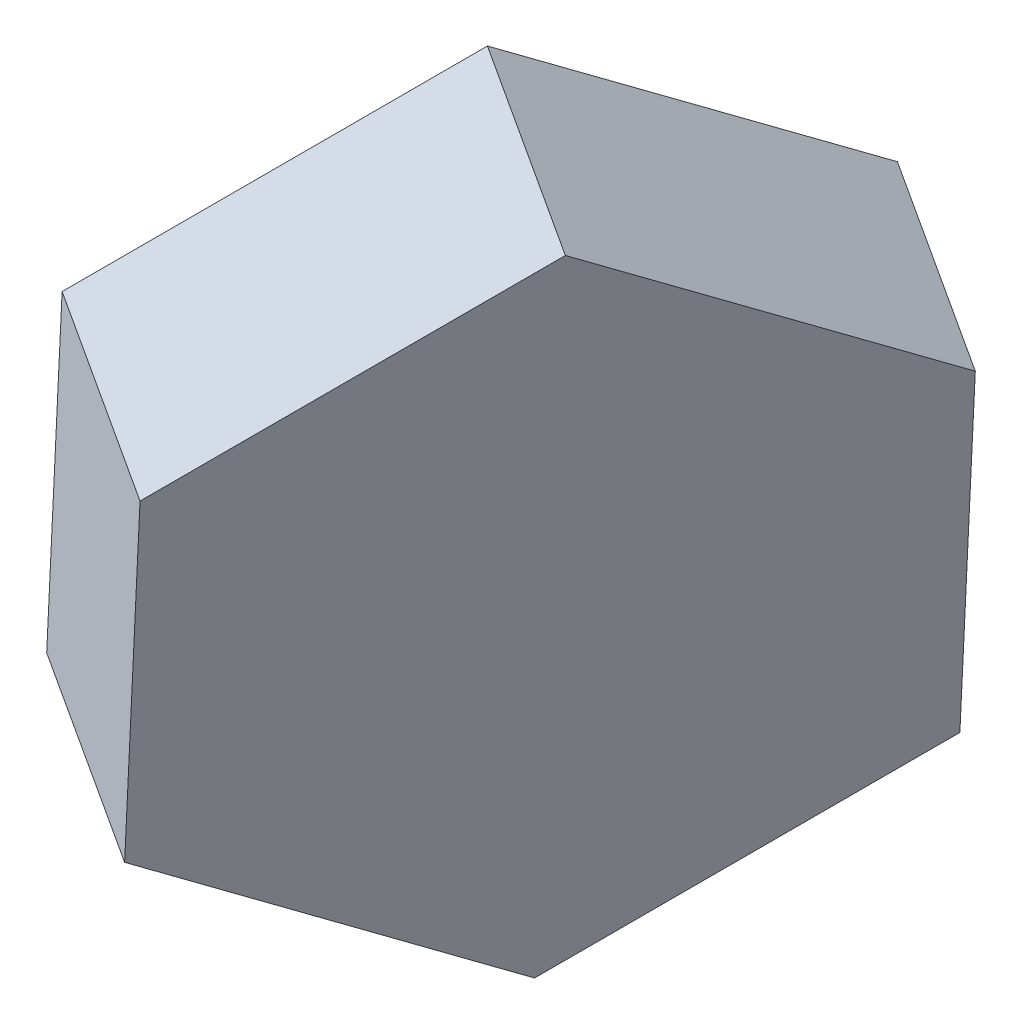
ISO-10303-21;
HEADER;
FILE_DESCRIPTION(('STEP AP214'),'2;1');
FILE_NAME('part.step','',(''),(''),'','','');
FILE_SCHEMA(('AUTOMOTIVE_DESIGN { 1 0 10303 214 1 1 1 1 }'));
ENDSEC;
DATA;
#1=APPLICATION_CONTEXT('core data for automotive mechanical design processes');
#2=APPLICATION_PROTOCOL_DEFINITION('international standard','automotive_design',2000,#1);
#3=PRODUCT_CONTEXT('',#1,'mechanical');
#4=PRODUCT('Part','Part','',(#3));
#5=PRODUCT_RELATED_PRODUCT_CATEGORY('part','',(#4));
#6=PRODUCT_DEFINITION_FORMATION('','',#4);
#7=PRODUCT_DEFINITION_CONTEXT('part definition',#1,'design');
#8=PRODUCT_DEFINITION('design','',#6,#7);
#9=PRODUCT_DEFINITION_SHAPE('','',#8);
#10=(LENGTH_UNIT() NAMED_UNIT(*) SI_UNIT(.MILLI.,.METRE.));
#11=(NAMED_UNIT(*) PLANE_ANGLE_UNIT() SI_UNIT($,.RADIAN.));
#12=(NAMED_UNIT(*) SI_UNIT($,.STERADIAN.) SOLID_ANGLE_UNIT());
#13=UNCERTAINTY_MEASURE_WITH_UNIT(LENGTH_MEASURE(1.E-05),#10,'distance_accuracy_value','');
#14=(GEOMETRIC_REPRESENTATION_CONTEXT(3) GLOBAL_UNCERTAINTY_ASSIGNED_CONTEXT((#13)) GLOBAL_UNIT_ASSIGNED_CONTEXT((#10,
#11,#12)) REPRESENTATION_CONTEXT('',''));
#15=CARTESIAN_POINT('',(0.,0.,0.));
#16=DIRECTION('',(0.,0.,1.));
#17=DIRECTION('',(1.,0.,0.));
#18=AXIS2_PLACEMENT_3D('',#15,#16,#17);
#19=CARTESIAN_POINT('',(12.2624510546371,7.26245105463715,-3.80619068347139));
#20=DIRECTION('',(-0.359789397188855,-0.859789397188857,0.362372435695795));
#21=DIRECTION('',(0.376826484044321,-0.489198919740116,-0.786566092485494));
#22=AXIS2_PLACEMENT_3D('',#19,#20,#21);
#23=PLANE('',#22);
#24=DIRECTION('',(-0.376826484044321,0.489198919740116,0.786566092485494));
#25=VECTOR('',#24,1.);
#26=CARTESIAN_POINT('',(3.72691714870437,8.72691714870441,-8.80619068347137));
#27=LINE('',#26,#25);
#28=CARTESIAN_POINT('',(3.72691714870437,8.72691714870441,-8.80619068347137));
#29=VERTEX_POINT('',#28);
#30=CARTESIAN_POINT('',(-2.29830025345089,16.5488988011061,3.77050418554278));
#31=VERTEX_POINT('',#30);
#32=EDGE_CURVE('E119',#29,#31,#27,.T.);
#33=ORIENTED_EDGE('',*,*,#32,.T.);
#34=DIRECTION('',(-0.853553390593275,0.146446609406726,-0.499999999999998));
#35=VECTOR('',#34,1.);
#36=CARTESIAN_POINT('',(6.23723365248186,15.0844327070388,8.77050418554277));
#37=LINE('',#36,#35);
#38=CARTESIAN_POINT('',(6.23723365248186,15.0844327070388,8.77050418554277));
#39=VERTEX_POINT('',#38);
#40=EDGE_CURVE('E42',#39,#31,#37,.T.);
#41=ORIENTED_EDGE('',*,*,#40,.F.);
#42=DIRECTION('',(-0.376826484044321,0.489198919740116,0.786566092485494));
#43=VECTOR('',#42,1.);
#44=CARTESIAN_POINT('',(12.2624510546371,7.26245105463715,-3.80619068347139));
#45=LINE('',#44,#43);
#46=CARTESIAN_POINT('',(12.2624510546371,7.26245105463715,-3.80619068347139));
#47=VERTEX_POINT('',#46);
#48=EDGE_CURVE('E130',#47,#39,#45,.T.);
#49=ORIENTED_EDGE('',*,*,#48,.F.);
#50=DIRECTION('',(-0.853553390593275,0.146446609406726,-0.499999999999998));
#51=VECTOR('',#50,1.);
#52=CARTESIAN_POINT('',(12.2624510546371,7.26245105463715,-3.80619068347139));
#53=LINE('',#52,#51);
#54=EDGE_CURVE('E115',#47,#29,#53,.T.);
#55=ORIENTED_EDGE('',*,*,#54,.T.);
#56=EDGE_LOOP('',(#33,#41,#49,#55));
#57=FACE_BOUND('',#56,.T.);
#58=ADVANCED_FACE('F34',(#57),#23,.F.);
#59=CARTESIAN_POINT('',(6.23723365248186,15.0844327070388,8.77050418554277));
#60=DIRECTION('',(0.146446609406726,-0.853553390593274,-0.5));
#61=DIRECTION('',(0.499999999999998,0.5,-0.707106781186549));
#62=AXIS2_PLACEMENT_3D('',#59,#60,#61);
#63=PLANE('',#62);
#64=DIRECTION('',(-0.499999999999998,-0.5,0.707106781186549));
#65=VECTOR('',#64,1.);
#66=CARTESIAN_POINT('',(-2.29830025345089,16.5488988011061,3.77050418554278));
#67=LINE('',#66,#65);
#68=CARTESIAN_POINT('',(-10.2929843551216,8.55421469943528,15.0766948690142));
#69=VERTEX_POINT('',#68);
#70=EDGE_CURVE('E122',#31,#69,#67,.T.);
#71=ORIENTED_EDGE('',*,*,#70,.T.);
#72=DIRECTION('',(-0.853553390593275,0.146446609406726,-0.499999999999998));
#73=VECTOR('',#72,1.);
#74=CARTESIAN_POINT('',(-1.75745044918888,7.08974860536802,20.0766948690141));
#75=LINE('',#74,#73);
#76=CARTESIAN_POINT('',(-1.75745044918888,7.08974860536802,20.0766948690141));
#77=VERTEX_POINT('',#76);
#78=EDGE_CURVE('E134',#77,#69,#75,.T.);
#79=ORIENTED_EDGE('',*,*,#78,.F.);
#80=DIRECTION('',(-0.499999999999998,-0.5,0.707106781186549));
#81=VECTOR('',#80,1.);
#82=CARTESIAN_POINT('',(6.23723365248186,15.0844327070388,8.77050418554277));
#83=LINE('',#82,#81);
#84=EDGE_CURVE('E88',#39,#77,#83,.T.);
#85=ORIENTED_EDGE('',*,*,#84,.F.);
#86=ORIENTED_EDGE('',*,*,#40,.T.);
#87=EDGE_LOOP('',(#71,#79,#85,#86));
#88=FACE_BOUND('',#87,.T.);
#89=ADVANCED_FACE('F137',(#88),#63,.F.);
#90=CARTESIAN_POINT('',(-1.75745044918888,7.08974860536802,20.0766948690141));
#91=DIRECTION('',(0.506236006595581,0.00623600659558271,-0.862372435695796));
#92=DIRECTION('',(0.123173515955677,0.989198919740117,0.0794593112989452));
#93=AXIS2_PLACEMENT_3D('',#90,#91,#92);
#94=PLANE('',#93);
#95=DIRECTION('',(-0.123173515955677,-0.989198919740117,-0.0794593112989452));
#96=VECTOR('',#95,1.);
#97=CARTESIAN_POINT('',(-10.2929843551216,8.55421469943528,15.0766948690142));
#98=LINE('',#97,#96);
#99=CARTESIAN_POINT('',(-12.2624510546371,-7.26245105463714,13.8061906834714));
#100=VERTEX_POINT('',#99);
#101=EDGE_CURVE('E125',#69,#100,#98,.T.);
#102=ORIENTED_EDGE('',*,*,#101,.T.);
#103=DIRECTION('',(-0.853553390593275,0.146446609406726,-0.499999999999998));
#104=VECTOR('',#103,1.);
#105=CARTESIAN_POINT('',(-3.72691714870437,-8.7269171487044,18.8061906834714));
#106=LINE('',#105,#104);
#107=CARTESIAN_POINT('',(-3.72691714870437,-8.7269171487044,18.8061906834714));
#108=VERTEX_POINT('',#107);
#109=EDGE_CURVE('E110',#108,#100,#106,.T.);
#110=ORIENTED_EDGE('',*,*,#109,.F.);
#111=DIRECTION('',(-0.123173515955677,-0.989198919740117,-0.0794593112989452));
#112=VECTOR('',#111,1.);
#113=CARTESIAN_POINT('',(-1.75745044918888,7.08974860536802,20.0766948690141));
#114=LINE('',#113,#112);
#115=EDGE_CURVE('E101',#77,#108,#114,.T.);
#116=ORIENTED_EDGE('',*,*,#115,.F.);
#117=ORIENTED_EDGE('',*,*,#78,.T.);
#118=EDGE_LOOP('',(#102,#110,#116,#117));
#119=FACE_BOUND('',#118,.T.);
#120=ADVANCED_FACE('F145',(#119),#94,.F.);
#121=CARTESIAN_POINT('',(-3.72691714870437,-8.7269171487044,18.8061906834714));
#122=DIRECTION('',(0.359789397188855,0.859789397188856,-0.362372435695796));
#123=DIRECTION('',(-0.376826484044321,0.489198919740117,0.786566092485494));
#124=AXIS2_PLACEMENT_3D('',#121,#122,#123);
#125=PLANE('',#124);
#126=DIRECTION('',(0.376826484044321,-0.489198919740117,-0.786566092485494));
#127=VECTOR('',#126,1.);
#128=CARTESIAN_POINT('',(-12.2624510546371,-7.26245105463714,13.8061906834714));
#129=LINE('',#128,#127);
#130=CARTESIAN_POINT('',(-6.23723365248187,-15.0844327070388,1.22949581445724));
#131=VERTEX_POINT('',#130);
#132=EDGE_CURVE('E109',#100,#131,#129,.T.);
#133=ORIENTED_EDGE('',*,*,#132,.T.);
#134=DIRECTION('',(-0.853553390593275,0.146446609406726,-0.499999999999998));
#135=VECTOR('',#134,1.);
#136=CARTESIAN_POINT('',(2.29830025345088,-16.548898801106,6.22949581445722));
#137=LINE('',#136,#135);
#138=CARTESIAN_POINT('',(2.29830025345088,-16.548898801106,6.22949581445722));
#139=VERTEX_POINT('',#138);
#140=EDGE_CURVE('E106',#139,#131,#137,.T.);
#141=ORIENTED_EDGE('',*,*,#140,.F.);
#142=DIRECTION('',(0.376826484044321,-0.489198919740117,-0.786566092485494));
#143=VECTOR('',#142,1.);
#144=CARTESIAN_POINT('',(-3.72691714870437,-8.7269171487044,18.8061906834714));
#145=LINE('',#144,#143);
#146=EDGE_CURVE('E95',#108,#139,#145,.T.);
#147=ORIENTED_EDGE('',*,*,#146,.F.);
#148=ORIENTED_EDGE('',*,*,#109,.T.);
#149=EDGE_LOOP('',(#133,#141,#147,#148));
#150=FACE_BOUND('',#149,.T.);
#151=ADVANCED_FACE('F107',(#150),#125,.F.);
#152=CARTESIAN_POINT('',(2.29830025345088,-16.548898801106,6.22949581445722));
#153=DIRECTION('',(-0.146446609406726,0.853553390593274,0.5));
#154=DIRECTION('',(0.853553390593275,-0.146446609406726,0.499999999999998));
#155=AXIS2_PLACEMENT_3D('',#152,#153,#154);
#156=PLANE('',#155);
#157=DIRECTION('',(0.499999999999998,0.5,-0.707106781186549));
#158=VECTOR('',#157,1.);
#159=CARTESIAN_POINT('',(-6.23723365248187,-15.0844327070388,1.22949581445724));
#160=LINE('',#159,#158);
#161=CARTESIAN_POINT('',(1.75745044918888,-7.08974860536802,-10.0766948690141));
#162=VERTEX_POINT('',#161);
#163=EDGE_CURVE('E73',#131,#162,#160,.T.);
#164=ORIENTED_EDGE('',*,*,#163,.T.);
#165=DIRECTION('',(-0.853553390593275,0.146446609406726,-0.499999999999998));
#166=VECTOR('',#165,1.);
#167=CARTESIAN_POINT('',(10.2929843551216,-8.55421469943528,-5.07669486901416));
#168=LINE('',#167,#166);
#169=CARTESIAN_POINT('',(10.2929843551216,-8.55421469943528,-5.07669486901416));
#170=VERTEX_POINT('',#169);
#171=EDGE_CURVE('E111',#170,#162,#168,.T.);
#172=ORIENTED_EDGE('',*,*,#171,.F.);
#173=DIRECTION('',(0.499999999999998,0.5,-0.707106781186549));
#174=VECTOR('',#173,1.);
#175=CARTESIAN_POINT('',(2.29830025345088,-16.548898801106,6.22949581445722));
#176=LINE('',#175,#174);
#177=EDGE_CURVE('E99',#139,#170,#176,.T.);
#178=ORIENTED_EDGE('',*,*,#177,.F.);
#179=ORIENTED_EDGE('',*,*,#140,.T.);
#180=EDGE_LOOP('',(#164,#172,#178,#179));
#181=FACE_BOUND('',#180,.T.);
#182=ADVANCED_FACE('F113',(#181),#156,.F.);
#183=CARTESIAN_POINT('',(10.2929843551216,-8.55421469943528,-5.07669486901416));
#184=DIRECTION('',(-0.506236006595581,-0.00623600659558249,0.862372435695796));
#185=DIRECTION('',(-0.123173515955678,-0.989198919740117,-0.0794593112989451));
#186=AXIS2_PLACEMENT_3D('',#183,#184,#185);
#187=PLANE('',#186);
#188=DIRECTION('',(0.123173515955678,0.989198919740117,0.0794593112989451));
#189=VECTOR('',#188,1.);
#190=CARTESIAN_POINT('',(1.75745044918888,-7.08974860536802,-10.0766948690141));
#191=LINE('',#190,#189);
#192=EDGE_CURVE('E79',#162,#29,#191,.T.);
#193=ORIENTED_EDGE('',*,*,#192,.T.);
#194=ORIENTED_EDGE('',*,*,#54,.F.);
#195=DIRECTION('',(0.123173515955678,0.989198919740117,0.0794593112989451));
#196=VECTOR('',#195,1.);
#197=CARTESIAN_POINT('',(10.2929843551216,-8.55421469943528,-5.07669486901416));
#198=LINE('',#197,#196);
#199=EDGE_CURVE('E50',#170,#47,#198,.T.);
#200=ORIENTED_EDGE('',*,*,#199,.F.);
#201=ORIENTED_EDGE('',*,*,#171,.T.);
#202=EDGE_LOOP('',(#193,#194,#200,#201));
#203=FACE_BOUND('',#202,.T.);
#204=ADVANCED_FACE('F167',(#203),#187,.F.);
#205=CARTESIAN_POINT('',(4.26776695296637,-0.732233047033628,7.49999999999999));
#206=DIRECTION('',(0.853553390593275,-0.146446609406726,0.499999999999998));
#207=DIRECTION('',(0.499999999999998,0.5,-0.707106781186549));
#208=AXIS2_PLACEMENT_3D('',#205,#206,#207);
#209=PLANE('',#208);
#210=ORIENTED_EDGE('',*,*,#48,.T.);
#211=ORIENTED_EDGE('',*,*,#84,.T.);
#212=ORIENTED_EDGE('',*,*,#115,.T.);
#213=ORIENTED_EDGE('',*,*,#146,.T.);
#214=ORIENTED_EDGE('',*,*,#177,.T.);
#215=ORIENTED_EDGE('',*,*,#199,.T.);
#216=EDGE_LOOP('',(#210,#211,#212,#213,#214,#215));
#217=FACE_BOUND('',#216,.T.);
#218=ADVANCED_FACE('F97',(#217),#209,.T.);
#219=CARTESIAN_POINT('',(-4.26776695296638,0.732233047033629,2.50000000000001));
#220=DIRECTION('',(0.853553390593275,-0.146446609406726,0.499999999999998));
#221=DIRECTION('',(0.499999999999998,0.5,-0.707106781186549));
#222=AXIS2_PLACEMENT_3D('',#219,#220,#221);
#223=PLANE('',#222);
#224=CARTESIAN_POINT('',(-4.26776695296638,0.73223304703363,2.50000000000001));
#225=DIRECTION('',(0.853553390593275,-0.146446609406726,0.499999999999998));
#226=DIRECTION('',(0.505449465124422,0.,-0.862856209461018));
#227=AXIS2_PLACEMENT_3D('',#224,#225,#226);
#228=CIRCLE('',#227,4.);
#229=CARTESIAN_POINT('',(-2.24596909246869,0.73223304703363,-0.951424837844061));
#230=VERTEX_POINT('',#229);
#231=EDGE_CURVE('E11',#230,#230,#228,.F.);
#232=ORIENTED_EDGE('',*,*,#231,.F.);
#233=EDGE_LOOP('',(#232));
#234=FACE_BOUND('',#233,.T.);
#235=ORIENTED_EDGE('',*,*,#32,.F.);
#236=ORIENTED_EDGE('',*,*,#192,.F.);
#237=ORIENTED_EDGE('',*,*,#163,.F.);
#238=ORIENTED_EDGE('',*,*,#132,.F.);
#239=ORIENTED_EDGE('',*,*,#101,.F.);
#240=ORIENTED_EDGE('',*,*,#70,.F.);
#241=EDGE_LOOP('',(#235,#236,#237,#238,#239,#240));
#242=FACE_BOUND('',#241,.T.);
#243=ADVANCED_FACE('F142',(#234,#242),#223,.F.);
#244=CARTESIAN_POINT('',(-6.8284271247462,1.17157287525381,1.00000000000001));
#245=DIRECTION('',(0.853553390593275,-0.146446609406726,0.499999999999999));
#246=DIRECTION('',(0.505449465124422,0.,-0.862856209461018));
#247=AXIS2_PLACEMENT_3D('',#244,#245,#246);
#248=CYLINDRICAL_SURFACE('',#247,4.);
#249=CARTESIAN_POINT('',(-6.8284271247462,1.17157287525381,1.00000000000001));
#250=DIRECTION('',(-0.853553390593275,0.146446609406726,-0.499999999999998));
#251=DIRECTION('',(-0.505449465124422,0.,0.862856209461018));
#252=AXIS2_PLACEMENT_3D('',#249,#250,#251);
#253=CIRCLE('',#252,4.);
#254=CARTESIAN_POINT('',(-8.85022498524389,1.17157287525381,4.45142483784409));
#255=VERTEX_POINT('',#254);
#256=EDGE_CURVE('E123',#255,#255,#253,.T.);
#257=ORIENTED_EDGE('',*,*,#256,.F.);
#258=EDGE_LOOP('',(#257));
#259=FACE_BOUND('',#258,.T.);
#260=ORIENTED_EDGE('',*,*,#231,.T.);
#261=EDGE_LOOP('',(#260));
#262=FACE_BOUND('',#261,.T.);
#263=ADVANCED_FACE('F154',(#259,#262),#248,.T.);
#264=CARTESIAN_POINT('',(-6.8284271247462,1.17157287525381,1.00000000000001));
#265=DIRECTION('',(-0.853553390593275,0.146446609406726,-0.499999999999998));
#266=DIRECTION('',(-0.505449465124422,0.,0.862856209461018));
#267=AXIS2_PLACEMENT_3D('',#264,#265,#266);
#268=PLANE('',#267);
#269=ORIENTED_EDGE('',*,*,#256,.T.);
#270=EDGE_LOOP('',(#269));
#271=FACE_BOUND('',#270,.T.);
#272=ADVANCED_FACE('F152',(#271),#268,.T.);
#273=CLOSED_SHELL('',(#58,#89,#120,#151,#182,#204,#218,#243,#263,#272));
#274=MANIFOLD_SOLID_BREP('B2',#273);
#275=ADVANCED_BREP_SHAPE_REPRESENTATION('',(#18,#274),#14);
#276=SHAPE_DEFINITION_REPRESENTATION(#9,#275);
ENDSEC;
END-ISO-10303-21;
